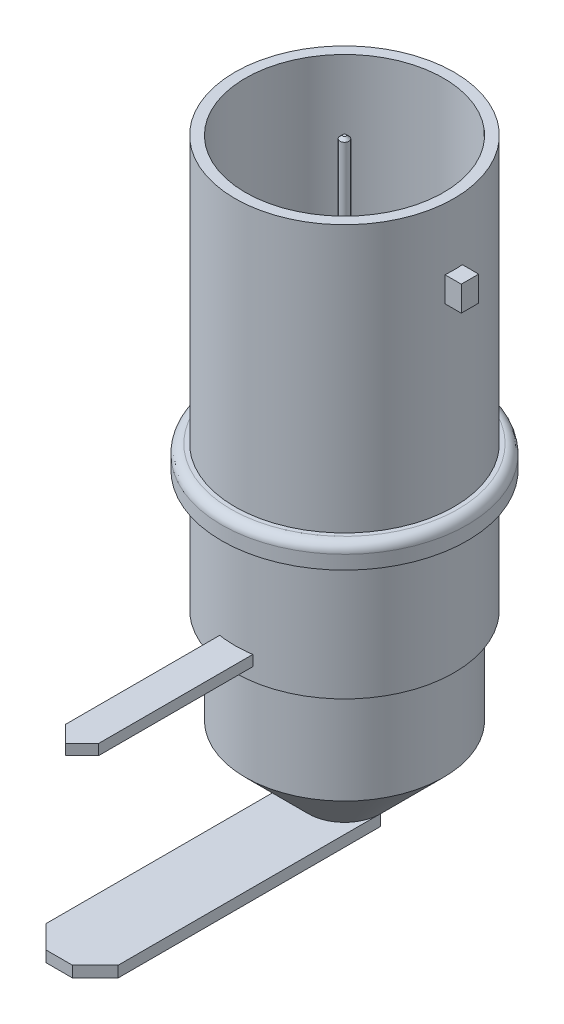
ISO-10303-21;
HEADER;
FILE_DESCRIPTION(('STEP AP214'),'2;1');
FILE_NAME('part.step','',(''),(''),'','','');
FILE_SCHEMA(('AUTOMOTIVE_DESIGN { 1 0 10303 214 1 1 1 1 }'));
ENDSEC;
DATA;
#1=APPLICATION_CONTEXT('core data for automotive mechanical design processes');
#2=APPLICATION_PROTOCOL_DEFINITION('international standard','automotive_design',2000,#1);
#3=PRODUCT_CONTEXT('',#1,'mechanical');
#4=PRODUCT('Part','Part','',(#3));
#5=PRODUCT_RELATED_PRODUCT_CATEGORY('part','',(#4));
#6=PRODUCT_DEFINITION_FORMATION('','',#4);
#7=PRODUCT_DEFINITION_CONTEXT('part definition',#1,'design');
#8=PRODUCT_DEFINITION('design','',#6,#7);
#9=PRODUCT_DEFINITION_SHAPE('','',#8);
#10=(LENGTH_UNIT() NAMED_UNIT(*) SI_UNIT(.MILLI.,.METRE.));
#11=(NAMED_UNIT(*) PLANE_ANGLE_UNIT() SI_UNIT($,.RADIAN.));
#12=(NAMED_UNIT(*) SI_UNIT($,.STERADIAN.) SOLID_ANGLE_UNIT());
#13=UNCERTAINTY_MEASURE_WITH_UNIT(LENGTH_MEASURE(1.E-05),#10,'distance_accuracy_value','');
#14=(GEOMETRIC_REPRESENTATION_CONTEXT(3) GLOBAL_UNCERTAINTY_ASSIGNED_CONTEXT((#13)) GLOBAL_UNIT_ASSIGNED_CONTEXT((#10,
#11,#12)) REPRESENTATION_CONTEXT('',''));
#15=CARTESIAN_POINT('',(0.,0.,0.));
#16=DIRECTION('',(0.,0.,1.));
#17=DIRECTION('',(1.,0.,0.));
#18=AXIS2_PLACEMENT_3D('',#15,#16,#17);
#19=CARTESIAN_POINT('',(0.,-7.2,0.));
#20=DIRECTION('',(0.,1.,0.));
#21=DIRECTION('',(0.,0.,1.));
#22=AXIS2_PLACEMENT_3D('',#19,#20,#21);
#23=CYLINDRICAL_SURFACE('',#22,4.34149701495423);
#24=CARTESIAN_POINT('',(0.,-4.2,0.));
#25=DIRECTION('',(0.,1.,0.));
#26=DIRECTION('',(0.,0.,1.));
#27=AXIS2_PLACEMENT_3D('',#24,#25,#26);
#28=CIRCLE('',#27,4.34149701495423);
#29=CARTESIAN_POINT('',(0.,-4.2,4.34149701495423));
#30=VERTEX_POINT('',#29);
#31=EDGE_CURVE('E52',#30,#30,#28,.T.);
#32=ORIENTED_EDGE('',*,*,#31,.T.);
#33=EDGE_LOOP('',(#32));
#34=FACE_BOUND('',#33,.T.);
#35=CARTESIAN_POINT('',(0.,9.3,0.));
#36=DIRECTION('',(0.,1.,0.));
#37=DIRECTION('',(0.,0.,1.));
#38=AXIS2_PLACEMENT_3D('',#35,#36,#37);
#39=CIRCLE('',#38,4.34149701495423);
#40=CARTESIAN_POINT('',(0.,9.3,4.34149701495423));
#41=VERTEX_POINT('',#40);
#42=EDGE_CURVE('E56',#41,#41,#39,.T.);
#43=ORIENTED_EDGE('',*,*,#42,.F.);
#44=EDGE_LOOP('',(#43));
#45=FACE_BOUND('',#44,.T.);
#46=ADVANCED_FACE('F44',(#34,#45),#23,.T.);
#47=CARTESIAN_POINT('',(0.,-7.2,0.));
#48=DIRECTION('',(0.,1.,0.));
#49=DIRECTION('',(0.,0.,1.));
#50=AXIS2_PLACEMENT_3D('',#47,#48,#49);
#51=PLANE('',#50);
#52=CARTESIAN_POINT('',(0.,-7.2,0.));
#53=DIRECTION('',(0.,1.,0.));
#54=DIRECTION('',(0.,0.,1.));
#55=AXIS2_PLACEMENT_3D('',#52,#53,#54);
#56=CIRCLE('',#55,1.34149701495422);
#57=CARTESIAN_POINT('',(0.,-7.2,1.34149701495421));
#58=VERTEX_POINT('',#57);
#59=EDGE_CURVE('E11',#58,#58,#56,.F.);
#60=ORIENTED_EDGE('',*,*,#59,.T.);
#61=EDGE_LOOP('',(#60));
#62=FACE_BOUND('',#61,.T.);
#63=ADVANCED_FACE('F66',(#62),#51,.F.);
#64=CARTESIAN_POINT('',(0.,9.3,0.));
#65=DIRECTION('',(0.,1.,0.));
#66=DIRECTION('',(0.,0.,1.));
#67=AXIS2_PLACEMENT_3D('',#64,#65,#66);
#68=PLANE('',#67);
#69=ORIENTED_EDGE('',*,*,#42,.T.);
#70=EDGE_LOOP('',(#69));
#71=FACE_BOUND('',#70,.T.);
#72=ADVANCED_FACE('F63',(#71),#68,.T.);
#73=CARTESIAN_POINT('',(0.,-4.2,0.));
#74=DIRECTION('',(0.,1.,0.));
#75=DIRECTION('',(0.,0.,1.));
#76=AXIS2_PLACEMENT_3D('',#73,#74,#75);
#77=CONICAL_SURFACE('',#76,4.34149701495423,0.78539816339745);
#78=CARTESIAN_POINT('',(0.,-7.2,1.34149701495421));
#79=CARTESIAN_POINT('',(0.,-7.16875,1.37274701495421));
#80=CARTESIAN_POINT('',(0.,-7.1375,1.40399701495421));
#81=CARTESIAN_POINT('',(0.,-7.075,1.46649701495422));
#82=CARTESIAN_POINT('',(0.,-7.04375,1.49774701495422));
#83=CARTESIAN_POINT('',(0.,-6.98125,1.56024701495422));
#84=CARTESIAN_POINT('',(0.,-6.95,1.59149701495422));
#85=CARTESIAN_POINT('',(0.,-6.8875,1.65399701495422));
#86=CARTESIAN_POINT('',(0.,-6.85625,1.68524701495422));
#87=CARTESIAN_POINT('',(0.,-6.79375,1.74774701495422));
#88=CARTESIAN_POINT('',(0.,-6.7625,1.77899701495422));
#89=CARTESIAN_POINT('',(0.,-6.7,1.84149701495422));
#90=CARTESIAN_POINT('',(0.,-6.66875,1.87274701495422));
#91=CARTESIAN_POINT('',(0.,-6.60625,1.93524701495422));
#92=CARTESIAN_POINT('',(0.,-6.575,1.96649701495422));
#93=CARTESIAN_POINT('',(0.,-6.5125,2.02899701495422));
#94=CARTESIAN_POINT('',(0.,-6.48125,2.06024701495422));
#95=CARTESIAN_POINT('',(0.,-6.41875,2.12274701495422));
#96=CARTESIAN_POINT('',(0.,-6.3875,2.15399701495422));
#97=CARTESIAN_POINT('',(0.,-6.325,2.21649701495422));
#98=CARTESIAN_POINT('',(0.,-6.29375,2.24774701495422));
#99=CARTESIAN_POINT('',(0.,-6.23125,2.31024701495422));
#100=CARTESIAN_POINT('',(0.,-6.2,2.34149701495422));
#101=CARTESIAN_POINT('',(0.,-6.1375,2.40399701495422));
#102=CARTESIAN_POINT('',(0.,-6.10625,2.43524701495422));
#103=CARTESIAN_POINT('',(0.,-6.04375,2.49774701495422));
#104=CARTESIAN_POINT('',(0.,-6.0125,2.52899701495422));
#105=CARTESIAN_POINT('',(0.,-5.95,2.59149701495422));
#106=CARTESIAN_POINT('',(0.,-5.91875,2.62274701495422));
#107=CARTESIAN_POINT('',(0.,-5.85625,2.68524701495422));
#108=CARTESIAN_POINT('',(0.,-5.825,2.71649701495422));
#109=CARTESIAN_POINT('',(0.,-5.7625,2.77899701495422));
#110=CARTESIAN_POINT('',(0.,-5.73125,2.81024701495422));
#111=CARTESIAN_POINT('',(0.,-5.66875,2.87274701495422));
#112=CARTESIAN_POINT('',(0.,-5.6375,2.90399701495422));
#113=CARTESIAN_POINT('',(0.,-5.575,2.96649701495422));
#114=CARTESIAN_POINT('',(0.,-5.54375,2.99774701495422));
#115=CARTESIAN_POINT('',(0.,-5.48125,3.06024701495422));
#116=CARTESIAN_POINT('',(0.,-5.45,3.09149701495422));
#117=CARTESIAN_POINT('',(0.,-5.3875,3.15399701495422));
#118=CARTESIAN_POINT('',(0.,-5.35625,3.18524701495422));
#119=CARTESIAN_POINT('',(0.,-5.29375,3.24774701495422));
#120=CARTESIAN_POINT('',(0.,-5.2625,3.27899701495422));
#121=CARTESIAN_POINT('',(0.,-5.2,3.34149701495422));
#122=CARTESIAN_POINT('',(0.,-5.16875,3.37274701495422));
#123=CARTESIAN_POINT('',(0.,-5.10625,3.43524701495422));
#124=CARTESIAN_POINT('',(0.,-5.075,3.46649701495422));
#125=CARTESIAN_POINT('',(0.,-5.0125,3.52899701495422));
#126=CARTESIAN_POINT('',(0.,-4.98125,3.56024701495422));
#127=CARTESIAN_POINT('',(0.,-4.91875,3.62274701495422));
#128=CARTESIAN_POINT('',(0.,-4.8875,3.65399701495422));
#129=CARTESIAN_POINT('',(0.,-4.825,3.71649701495422));
#130=CARTESIAN_POINT('',(0.,-4.79375,3.74774701495422));
#131=CARTESIAN_POINT('',(0.,-4.73125,3.81024701495422));
#132=CARTESIAN_POINT('',(0.,-4.7,3.84149701495422));
#133=CARTESIAN_POINT('',(0.,-4.6375,3.90399701495422));
#134=CARTESIAN_POINT('',(0.,-4.60625,3.93524701495422));
#135=CARTESIAN_POINT('',(0.,-4.54375,3.99774701495422));
#136=CARTESIAN_POINT('',(0.,-4.5125,4.02899701495423));
#137=CARTESIAN_POINT('',(0.,-4.45,4.09149701495423));
#138=CARTESIAN_POINT('',(0.,-4.41875,4.12274701495423));
#139=CARTESIAN_POINT('',(0.,-4.35625,4.18524701495423));
#140=CARTESIAN_POINT('',(0.,-4.325,4.21649701495423));
#141=CARTESIAN_POINT('',(0.,-4.2625,4.27899701495423));
#142=CARTESIAN_POINT('',(0.,-4.23125,4.31024701495423));
#143=CARTESIAN_POINT('',(0.,-4.2,4.34149701495423));
#144=B_SPLINE_CURVE_WITH_KNOTS('',3,(#78,#79,#80,#81,#82,#83,#84,#85,#86,#87,#88,#89,#90,#91,
#92,#93,#94,#95,#96,#97,#98,#99,#100,#101,#102,#103,#104,#105,#106,#107,#108,#109,#110,#111,
#112,#113,#114,#115,#116,#117,#118,#119,#120,#121,#122,#123,#124,#125,#126,#127,#128,#129,#130,
#131,#132,#133,#134,#135,#136,#137,#138,#139,#140,#141,#142,#143),.UNSPECIFIED.,.F.,.F.,(4,2,2,
2,2,2,2,2,2,2,2,2,2,2,2,2,2,2,2,2,2,2,2,2,2,2,2,2,2,2,2,2,4),(0.,0.132582521472478,
0.265165042944956,0.397747564417433,0.530330085889911,0.662912607362389,0.795495128834868,
0.928077650307345,1.06066017177982,1.1932426932523,1.32582521472478,1.45840773619726,
1.59099025766974,1.72357277914221,1.85615530061469,1.98873782208717,2.12132034355965,
2.25390286503212,2.3864853865046,2.51906790797708,2.65165042944956,2.78423295092204,
2.91681547239451,3.04939799386699,3.18198051533947,3.31456303681195,3.44714555828442,
3.5797280797569,3.71231060122938,3.84489312270186,3.97747564417434,4.11005816564681,
4.24264068711929),.UNSPECIFIED.);
#145=EDGE_CURVE('BSEAM47',#58,#30,#144,.T.);
#146=ORIENTED_EDGE('',*,*,#59,.F.);
#147=ORIENTED_EDGE('',*,*,#31,.F.);
#148=ORIENTED_EDGE('',*,*,#145,.T.);
#149=ORIENTED_EDGE('',*,*,#145,.F.);
#150=EDGE_LOOP('',(#146,#148,#147,#149));
#151=FACE_BOUND('',#150,.T.);
#152=ADVANCED_FACE('F47',(#151),#77,.T.);
#153=CLOSED_SHELL('',(#46,#63,#72,#152));
#154=MANIFOLD_SOLID_BREP('B2',#153);
#155=CARTESIAN_POINT('',(1.58,-7.44245003517757,12.5));
#156=DIRECTION('',(-1.,0.,0.));
#157=DIRECTION('',(0.,0.,1.));
#158=AXIS2_PLACEMENT_3D('',#155,#156,#157);
#159=PLANE('',#158);
#160=DIRECTION('',(0.,0.,-1.));
#161=VECTOR('',#160,1.);
#162=CARTESIAN_POINT('',(1.58,-6.95754996482243,12.5));
#163=LINE('',#162,#161);
#164=CARTESIAN_POINT('',(1.58,-6.95754996482243,11.5));
#165=VERTEX_POINT('',#164);
#166=CARTESIAN_POINT('',(1.58,-6.95754996482243,0.));
#167=VERTEX_POINT('',#166);
#168=EDGE_CURVE('E165',#165,#167,#163,.T.);
#169=ORIENTED_EDGE('',*,*,#168,.F.);
#170=DIRECTION('',(0.,-1.,0.));
#171=VECTOR('',#170,1.);
#172=CARTESIAN_POINT('',(1.58,-7.44245003517757,11.5));
#173=LINE('',#172,#171);
#174=CARTESIAN_POINT('',(1.58,-7.44245003517757,11.5));
#175=VERTEX_POINT('',#174);
#176=EDGE_CURVE('E136',#165,#175,#173,.T.);
#177=ORIENTED_EDGE('',*,*,#176,.T.);
#178=DIRECTION('',(0.,0.,-1.));
#179=VECTOR('',#178,1.);
#180=CARTESIAN_POINT('',(1.58,-7.44245003517757,12.5));
#181=LINE('',#180,#179);
#182=CARTESIAN_POINT('',(1.58,-7.44245003517757,0.));
#183=VERTEX_POINT('',#182);
#184=EDGE_CURVE('E185',#175,#183,#181,.T.);
#185=ORIENTED_EDGE('',*,*,#184,.T.);
#186=DIRECTION('',(0.,1.,0.));
#187=VECTOR('',#186,1.);
#188=CARTESIAN_POINT('',(1.58,-7.44245003517757,0.));
#189=LINE('',#188,#187);
#190=EDGE_CURVE('E181',#183,#167,#189,.T.);
#191=ORIENTED_EDGE('',*,*,#190,.T.);
#192=EDGE_LOOP('',(#169,#177,#185,#191));
#193=FACE_BOUND('',#192,.T.);
#194=ADVANCED_FACE('F112',(#193),#159,.F.);
#195=CARTESIAN_POINT('',(-1.58,-6.95754996482243,12.5));
#196=DIRECTION('',(0.,-1.,0.));
#197=DIRECTION('',(0.,0.,-1.));
#198=AXIS2_PLACEMENT_3D('',#195,#196,#197);
#199=PLANE('',#198);
#200=DIRECTION('',(-1.,0.,0.));
#201=VECTOR('',#200,1.);
#202=CARTESIAN_POINT('',(-1.58,-6.95754996482243,12.5));
#203=LINE('',#202,#201);
#204=CARTESIAN_POINT('',(0.58,-6.95754996482243,12.5));
#205=VERTEX_POINT('',#204);
#206=CARTESIAN_POINT('',(-0.579999999999998,-6.95754996482243,12.5));
#207=VERTEX_POINT('',#206);
#208=EDGE_CURVE('E195',#205,#207,#203,.T.);
#209=ORIENTED_EDGE('',*,*,#208,.F.);
#210=DIRECTION('',(-0.707106781186546,0.,0.707106781186549));
#211=VECTOR('',#210,1.);
#212=CARTESIAN_POINT('',(0.580000000000001,-6.95754996482243,12.5));
#213=LINE('',#212,#211);
#214=EDGE_CURVE('E172',#205,#165,#213,.F.);
#215=ORIENTED_EDGE('',*,*,#214,.T.);
#216=ORIENTED_EDGE('',*,*,#168,.T.);
#217=DIRECTION('',(-1.,0.,0.));
#218=VECTOR('',#217,1.);
#219=CARTESIAN_POINT('',(-1.58,-6.95754996482243,0.));
#220=LINE('',#219,#218);
#221=CARTESIAN_POINT('',(-1.58,-6.95754996482243,0.));
#222=VERTEX_POINT('',#221);
#223=EDGE_CURVE('E170',#167,#222,#220,.T.);
#224=ORIENTED_EDGE('',*,*,#223,.T.);
#225=DIRECTION('',(0.,0.,-1.));
#226=VECTOR('',#225,1.);
#227=CARTESIAN_POINT('',(-1.58,-6.95754996482243,12.5));
#228=LINE('',#227,#226);
#229=CARTESIAN_POINT('',(-1.58,-6.95754996482243,11.5));
#230=VERTEX_POINT('',#229);
#231=EDGE_CURVE('E175',#230,#222,#228,.T.);
#232=ORIENTED_EDGE('',*,*,#231,.F.);
#233=DIRECTION('',(-0.707106781186546,0.,-0.707106781186549));
#234=VECTOR('',#233,1.);
#235=CARTESIAN_POINT('',(-0.579999999999998,-6.95754996482243,12.5));
#236=LINE('',#235,#234);
#237=EDGE_CURVE('E205',#230,#207,#236,.F.);
#238=ORIENTED_EDGE('',*,*,#237,.T.);
#239=EDGE_LOOP('',(#209,#215,#216,#224,#232,#238));
#240=FACE_BOUND('',#239,.T.);
#241=ADVANCED_FACE('F168',(#240),#199,.F.);
#242=CARTESIAN_POINT('',(-1.58,-7.44245003517757,12.5));
#243=DIRECTION('',(1.,0.,0.));
#244=DIRECTION('',(0.,0.,-1.));
#245=AXIS2_PLACEMENT_3D('',#242,#243,#244);
#246=PLANE('',#245);
#247=DIRECTION('',(0.,0.,-1.));
#248=VECTOR('',#247,1.);
#249=CARTESIAN_POINT('',(-1.58,-7.44245003517757,12.5));
#250=LINE('',#249,#248);
#251=CARTESIAN_POINT('',(-1.58,-7.44245003517757,11.5));
#252=VERTEX_POINT('',#251);
#253=CARTESIAN_POINT('',(-1.58,-7.44245003517757,0.));
#254=VERTEX_POINT('',#253);
#255=EDGE_CURVE('E197',#252,#254,#250,.T.);
#256=ORIENTED_EDGE('',*,*,#255,.F.);
#257=DIRECTION('',(0.,1.,0.));
#258=VECTOR('',#257,1.);
#259=CARTESIAN_POINT('',(-1.58,-7.44245003517757,11.5));
#260=LINE('',#259,#258);
#261=EDGE_CURVE('E42',#252,#230,#260,.T.);
#262=ORIENTED_EDGE('',*,*,#261,.T.);
#263=ORIENTED_EDGE('',*,*,#231,.T.);
#264=DIRECTION('',(0.,-1.,0.));
#265=VECTOR('',#264,1.);
#266=CARTESIAN_POINT('',(-1.58,-7.44245003517757,0.));
#267=LINE('',#266,#265);
#268=EDGE_CURVE('E183',#222,#254,#267,.T.);
#269=ORIENTED_EDGE('',*,*,#268,.T.);
#270=EDGE_LOOP('',(#256,#262,#263,#269));
#271=FACE_BOUND('',#270,.T.);
#272=ADVANCED_FACE('F233',(#271),#246,.F.);
#273=CARTESIAN_POINT('',(-1.58,-7.44245003517757,12.5));
#274=DIRECTION('',(0.,1.,0.));
#275=DIRECTION('',(0.,0.,1.));
#276=AXIS2_PLACEMENT_3D('',#273,#274,#275);
#277=PLANE('',#276);
#278=ORIENTED_EDGE('',*,*,#184,.F.);
#279=DIRECTION('',(0.707106781186546,0.,-0.707106781186549));
#280=VECTOR('',#279,1.);
#281=CARTESIAN_POINT('',(0.580000000000001,-7.44245003517757,12.5));
#282=LINE('',#281,#280);
#283=CARTESIAN_POINT('',(0.58,-7.44245003517757,12.5));
#284=VERTEX_POINT('',#283);
#285=EDGE_CURVE('E121',#175,#284,#282,.F.);
#286=ORIENTED_EDGE('',*,*,#285,.T.);
#287=DIRECTION('',(1.,0.,0.));
#288=VECTOR('',#287,1.);
#289=CARTESIAN_POINT('',(-1.58,-7.44245003517757,12.5));
#290=LINE('',#289,#288);
#291=CARTESIAN_POINT('',(-0.579999999999998,-7.44245003517757,12.5));
#292=VERTEX_POINT('',#291);
#293=EDGE_CURVE('E189',#292,#284,#290,.T.);
#294=ORIENTED_EDGE('',*,*,#293,.F.);
#295=DIRECTION('',(0.707106781186546,0.,0.707106781186549));
#296=VECTOR('',#295,1.);
#297=CARTESIAN_POINT('',(-0.579999999999998,-7.44245003517757,12.5));
#298=LINE('',#297,#296);
#299=EDGE_CURVE('E128',#292,#252,#298,.F.);
#300=ORIENTED_EDGE('',*,*,#299,.T.);
#301=ORIENTED_EDGE('',*,*,#255,.T.);
#302=DIRECTION('',(1.,0.,0.));
#303=VECTOR('',#302,1.);
#304=CARTESIAN_POINT('',(-1.58,-7.44245003517757,0.));
#305=LINE('',#304,#303);
#306=EDGE_CURVE('E193',#254,#183,#305,.T.);
#307=ORIENTED_EDGE('',*,*,#306,.T.);
#308=EDGE_LOOP('',(#278,#286,#294,#300,#301,#307));
#309=FACE_BOUND('',#308,.T.);
#310=ADVANCED_FACE('F211',(#309),#277,.F.);
#311=CARTESIAN_POINT('',(0.,0.,12.5));
#312=DIRECTION('',(0.,0.,-1.));
#313=DIRECTION('',(-1.,0.,0.));
#314=AXIS2_PLACEMENT_3D('',#311,#312,#313);
#315=PLANE('',#314);
#316=ORIENTED_EDGE('',*,*,#293,.T.);
#317=DIRECTION('',(0.,1.,0.));
#318=VECTOR('',#317,1.);
#319=CARTESIAN_POINT('',(0.580000000000001,0.,12.5));
#320=LINE('',#319,#318);
#321=EDGE_CURVE('E202',#284,#205,#320,.T.);
#322=ORIENTED_EDGE('',*,*,#321,.T.);
#323=ORIENTED_EDGE('',*,*,#208,.T.);
#324=DIRECTION('',(0.,-1.,0.));
#325=VECTOR('',#324,1.);
#326=CARTESIAN_POINT('',(-0.579999999999998,0.,12.5));
#327=LINE('',#326,#325);
#328=EDGE_CURVE('E174',#207,#292,#327,.T.);
#329=ORIENTED_EDGE('',*,*,#328,.T.);
#330=EDGE_LOOP('',(#316,#322,#323,#329));
#331=FACE_BOUND('',#330,.T.);
#332=ADVANCED_FACE('F215',(#331),#315,.F.);
#333=CARTESIAN_POINT('',(0.,0.,0.));
#334=DIRECTION('',(0.,0.,-1.));
#335=DIRECTION('',(-1.,0.,0.));
#336=AXIS2_PLACEMENT_3D('',#333,#334,#335);
#337=PLANE('',#336);
#338=ORIENTED_EDGE('',*,*,#190,.F.);
#339=ORIENTED_EDGE('',*,*,#306,.F.);
#340=ORIENTED_EDGE('',*,*,#268,.F.);
#341=ORIENTED_EDGE('',*,*,#223,.F.);
#342=EDGE_LOOP('',(#338,#339,#340,#341));
#343=FACE_BOUND('',#342,.T.);
#344=ADVANCED_FACE('F179',(#343),#337,.T.);
#345=CARTESIAN_POINT('',(0.580000000000001,0.,12.5));
#346=DIRECTION('',(-0.707106781186549,0.,-0.707106781186546));
#347=DIRECTION('',(0.,1.,0.));
#348=AXIS2_PLACEMENT_3D('',#345,#346,#347);
#349=PLANE('',#348);
#350=ORIENTED_EDGE('',*,*,#285,.F.);
#351=ORIENTED_EDGE('',*,*,#176,.F.);
#352=ORIENTED_EDGE('',*,*,#214,.F.);
#353=ORIENTED_EDGE('',*,*,#321,.F.);
#354=EDGE_LOOP('',(#350,#351,#352,#353));
#355=FACE_BOUND('',#354,.T.);
#356=ADVANCED_FACE('F218',(#355),#349,.F.);
#357=CARTESIAN_POINT('',(-0.579999999999998,0.,12.5));
#358=DIRECTION('',(0.707106781186549,0.,-0.707106781186546));
#359=DIRECTION('',(0.,-1.,0.));
#360=AXIS2_PLACEMENT_3D('',#357,#358,#359);
#361=PLANE('',#360);
#362=ORIENTED_EDGE('',*,*,#237,.F.);
#363=ORIENTED_EDGE('',*,*,#261,.F.);
#364=ORIENTED_EDGE('',*,*,#299,.F.);
#365=ORIENTED_EDGE('',*,*,#328,.F.);
#366=EDGE_LOOP('',(#362,#363,#364,#365));
#367=FACE_BOUND('',#366,.T.);
#368=ADVANCED_FACE('F115',(#367),#361,.F.);
#369=CLOSED_SHELL('',(#194,#241,#272,#310,#332,#344,#356,#368));
#370=MANIFOLD_SOLID_BREP('B6',#369);
#371=CARTESIAN_POINT('',(0.725000000000001,0.568107864049923,12.5));
#372=DIRECTION('',(-1.,0.,0.));
#373=DIRECTION('',(0.,0.,1.));
#374=AXIS2_PLACEMENT_3D('',#371,#372,#373);
#375=PLANE('',#374);
#376=DIRECTION('',(0.,0.,-1.));
#377=VECTOR('',#376,1.);
#378=CARTESIAN_POINT('',(0.725000000000001,1.03189213595008,12.5));
#379=LINE('',#378,#377);
#380=CARTESIAN_POINT('',(0.725000000000001,1.03189213595008,11.5));
#381=VERTEX_POINT('',#380);
#382=CARTESIAN_POINT('',(0.725000000000001,1.03189213595008,0.));
#383=VERTEX_POINT('',#382);
#384=EDGE_CURVE('E344',#381,#383,#379,.T.);
#385=ORIENTED_EDGE('',*,*,#384,.F.);
#386=DIRECTION('',(0.,-1.,0.));
#387=VECTOR('',#386,1.);
#388=CARTESIAN_POINT('',(0.725000000000001,0.568107864049923,11.5));
#389=LINE('',#388,#387);
#390=CARTESIAN_POINT('',(0.725000000000001,0.568107864049923,11.5));
#391=VERTEX_POINT('',#390);
#392=EDGE_CURVE('E110',#381,#391,#389,.T.);
#393=ORIENTED_EDGE('',*,*,#392,.T.);
#394=DIRECTION('',(0.,0.,-1.));
#395=VECTOR('',#394,1.);
#396=CARTESIAN_POINT('',(0.725000000000001,0.568107864049923,12.5));
#397=LINE('',#396,#395);
#398=CARTESIAN_POINT('',(0.725000000000001,0.568107864049923,0.));
#399=VERTEX_POINT('',#398);
#400=EDGE_CURVE('E364',#391,#399,#397,.T.);
#401=ORIENTED_EDGE('',*,*,#400,.T.);
#402=DIRECTION('',(0.,1.,0.));
#403=VECTOR('',#402,1.);
#404=CARTESIAN_POINT('',(0.725000000000001,0.568107864049923,0.));
#405=LINE('',#404,#403);
#406=EDGE_CURVE('E359',#399,#383,#405,.T.);
#407=ORIENTED_EDGE('',*,*,#406,.T.);
#408=EDGE_LOOP('',(#385,#393,#401,#407));
#409=FACE_BOUND('',#408,.T.);
#410=ADVANCED_FACE('F301',(#409),#375,.F.);
#411=CARTESIAN_POINT('',(-0.724999999999999,1.03189213595008,12.5));
#412=DIRECTION('',(0.,-1.,0.));
#413=DIRECTION('',(0.,0.,-1.));
#414=AXIS2_PLACEMENT_3D('',#411,#412,#413);
#415=PLANE('',#414);
#416=DIRECTION('',(0.,0.,-1.));
#417=VECTOR('',#416,1.);
#418=CARTESIAN_POINT('',(-0.724999999999999,1.03189213595008,12.5));
#419=LINE('',#418,#417);
#420=CARTESIAN_POINT('',(-0.724999999999999,1.03189213595008,11.5));
#421=VERTEX_POINT('',#420);
#422=CARTESIAN_POINT('',(-0.724999999999999,1.03189213595008,0.));
#423=VERTEX_POINT('',#422);
#424=EDGE_CURVE('E353',#421,#423,#419,.T.);
#425=ORIENTED_EDGE('',*,*,#424,.F.);
#426=DIRECTION('',(-0.707106781186546,0.,-0.707106781186549));
#427=VECTOR('',#426,1.);
#428=CARTESIAN_POINT('',(0.275000000000002,1.03189213595008,12.5));
#429=LINE('',#428,#427);
#430=CARTESIAN_POINT('',(0.,1.03189213595008,12.225));
#431=VERTEX_POINT('',#430);
#432=EDGE_CURVE('E311',#421,#431,#429,.F.);
#433=ORIENTED_EDGE('',*,*,#432,.T.);
#434=DIRECTION('',(-0.707106781186546,0.,0.707106781186549));
#435=VECTOR('',#434,1.);
#436=CARTESIAN_POINT('',(-0.275,1.03189213595008,12.5));
#437=LINE('',#436,#435);
#438=EDGE_CURVE('E321',#431,#381,#437,.F.);
#439=ORIENTED_EDGE('',*,*,#438,.T.);
#440=ORIENTED_EDGE('',*,*,#384,.T.);
#441=DIRECTION('',(-1.,0.,0.));
#442=VECTOR('',#441,1.);
#443=CARTESIAN_POINT('',(-0.724999999999999,1.03189213595008,0.));
#444=LINE('',#443,#442);
#445=EDGE_CURVE('E347',#383,#423,#444,.T.);
#446=ORIENTED_EDGE('',*,*,#445,.T.);
#447=EDGE_LOOP('',(#425,#433,#439,#440,#446));
#448=FACE_BOUND('',#447,.T.);
#449=ADVANCED_FACE('F346',(#448),#415,.F.);
#450=CARTESIAN_POINT('',(-0.724999999999999,0.568107864049923,12.5));
#451=DIRECTION('',(1.,0.,0.));
#452=DIRECTION('',(0.,0.,-1.));
#453=AXIS2_PLACEMENT_3D('',#450,#451,#452);
#454=PLANE('',#453);
#455=DIRECTION('',(0.,0.,-1.));
#456=VECTOR('',#455,1.);
#457=CARTESIAN_POINT('',(-0.724999999999999,0.568107864049923,12.5));
#458=LINE('',#457,#456);
#459=CARTESIAN_POINT('',(-0.724999999999999,0.568107864049923,11.5));
#460=VERTEX_POINT('',#459);
#461=CARTESIAN_POINT('',(-0.724999999999999,0.568107864049923,0.));
#462=VERTEX_POINT('',#461);
#463=EDGE_CURVE('E373',#460,#462,#458,.T.);
#464=ORIENTED_EDGE('',*,*,#463,.F.);
#465=DIRECTION('',(0.,1.,0.));
#466=VECTOR('',#465,1.);
#467=CARTESIAN_POINT('',(-0.724999999999999,0.568107864049923,11.5));
#468=LINE('',#467,#466);
#469=EDGE_CURVE('E379',#460,#421,#468,.T.);
#470=ORIENTED_EDGE('',*,*,#469,.T.);
#471=ORIENTED_EDGE('',*,*,#424,.T.);
#472=DIRECTION('',(0.,-1.,0.));
#473=VECTOR('',#472,1.);
#474=CARTESIAN_POINT('',(-0.724999999999999,0.568107864049923,0.));
#475=LINE('',#474,#473);
#476=EDGE_CURVE('E361',#423,#462,#475,.T.);
#477=ORIENTED_EDGE('',*,*,#476,.T.);
#478=EDGE_LOOP('',(#464,#470,#471,#477));
#479=FACE_BOUND('',#478,.T.);
#480=ADVANCED_FACE('F386',(#479),#454,.F.);
#481=CARTESIAN_POINT('',(-0.724999999999999,0.568107864049923,12.5));
#482=DIRECTION('',(0.,1.,0.));
#483=DIRECTION('',(0.,0.,1.));
#484=AXIS2_PLACEMENT_3D('',#481,#482,#483);
#485=PLANE('',#484);
#486=DIRECTION('',(0.707106781186546,0.,-0.707106781186549));
#487=VECTOR('',#486,1.);
#488=CARTESIAN_POINT('',(-0.275,0.568107864049923,12.5));
#489=LINE('',#488,#487);
#490=CARTESIAN_POINT('',(0.,0.568107864049923,12.225));
#491=VERTEX_POINT('',#490);
#492=EDGE_CURVE('E352',#391,#491,#489,.F.);
#493=ORIENTED_EDGE('',*,*,#492,.T.);
#494=DIRECTION('',(0.707106781186546,0.,0.707106781186549));
#495=VECTOR('',#494,1.);
#496=CARTESIAN_POINT('',(0.275000000000002,0.568107864049923,12.5));
#497=LINE('',#496,#495);
#498=EDGE_CURVE('E377',#491,#460,#497,.F.);
#499=ORIENTED_EDGE('',*,*,#498,.T.);
#500=ORIENTED_EDGE('',*,*,#463,.T.);
#501=DIRECTION('',(1.,0.,0.));
#502=VECTOR('',#501,1.);
#503=CARTESIAN_POINT('',(-0.724999999999999,0.568107864049923,0.));
#504=LINE('',#503,#502);
#505=EDGE_CURVE('E370',#462,#399,#504,.T.);
#506=ORIENTED_EDGE('',*,*,#505,.T.);
#507=ORIENTED_EDGE('',*,*,#400,.F.);
#508=EDGE_LOOP('',(#493,#499,#500,#506,#507));
#509=FACE_BOUND('',#508,.T.);
#510=ADVANCED_FACE('F394',(#509),#485,.F.);
#511=CARTESIAN_POINT('',(0.,0.,0.));
#512=DIRECTION('',(0.,0.,-1.));
#513=DIRECTION('',(-1.,0.,0.));
#514=AXIS2_PLACEMENT_3D('',#511,#512,#513);
#515=PLANE('',#514);
#516=ORIENTED_EDGE('',*,*,#406,.F.);
#517=ORIENTED_EDGE('',*,*,#505,.F.);
#518=ORIENTED_EDGE('',*,*,#476,.F.);
#519=ORIENTED_EDGE('',*,*,#445,.F.);
#520=EDGE_LOOP('',(#516,#517,#518,#519));
#521=FACE_BOUND('',#520,.T.);
#522=ADVANCED_FACE('F357',(#521),#515,.T.);
#523=CARTESIAN_POINT('',(-0.275,0.,12.5));
#524=DIRECTION('',(-0.707106781186549,0.,-0.707106781186546));
#525=DIRECTION('',(0.,1.,0.));
#526=AXIS2_PLACEMENT_3D('',#523,#524,#525);
#527=PLANE('',#526);
#528=ORIENTED_EDGE('',*,*,#392,.F.);
#529=ORIENTED_EDGE('',*,*,#438,.F.);
#530=DIRECTION('',(0.,1.,0.));
#531=VECTOR('',#530,1.);
#532=CARTESIAN_POINT('',(0.,0.,12.225));
#533=LINE('',#532,#531);
#534=EDGE_CURVE('E306',#491,#431,#533,.T.);
#535=ORIENTED_EDGE('',*,*,#534,.F.);
#536=ORIENTED_EDGE('',*,*,#492,.F.);
#537=EDGE_LOOP('',(#528,#529,#535,#536));
#538=FACE_BOUND('',#537,.T.);
#539=ADVANCED_FACE('F304',(#538),#527,.F.);
#540=CARTESIAN_POINT('',(0.275000000000002,0.,12.5));
#541=DIRECTION('',(0.707106781186549,0.,-0.707106781186546));
#542=DIRECTION('',(0.,-1.,0.));
#543=AXIS2_PLACEMENT_3D('',#540,#541,#542);
#544=PLANE('',#543);
#545=ORIENTED_EDGE('',*,*,#432,.F.);
#546=ORIENTED_EDGE('',*,*,#469,.F.);
#547=ORIENTED_EDGE('',*,*,#498,.F.);
#548=ORIENTED_EDGE('',*,*,#534,.T.);
#549=EDGE_LOOP('',(#545,#546,#547,#548));
#550=FACE_BOUND('',#549,.T.);
#551=ADVANCED_FACE('F389',(#550),#544,.F.);
#552=CLOSED_SHELL('',(#410,#449,#480,#510,#522,#539,#551));
#553=MANIFOLD_SOLID_BREP('B36',#552);
#554=CARTESIAN_POINT('',(0.,18.5513578094421,0.));
#555=DIRECTION('',(0.,-1.,0.));
#556=DIRECTION('',(0.,0.,-1.));
#557=AXIS2_PLACEMENT_3D('',#554,#555,#556);
#558=CYLINDRICAL_SURFACE('',#557,0.194934422958341);
#559=CARTESIAN_POINT('',(0.,17.873,0.));
#560=DIRECTION('',(0.,1.,0.));
#561=DIRECTION('',(0.,0.,1.));
#562=AXIS2_PLACEMENT_3D('',#559,#560,#561);
#563=CIRCLE('',#562,0.194934422958341);
#564=CARTESIAN_POINT('',(0.,17.873,0.194934422958341));
#565=VERTEX_POINT('',#564);
#566=EDGE_CURVE('E300',#565,#565,#563,.F.);
#567=ORIENTED_EDGE('',*,*,#566,.T.);
#568=EDGE_LOOP('',(#567));
#569=FACE_BOUND('',#568,.T.);
#570=CARTESIAN_POINT('',(0.,5.3,0.));
#571=DIRECTION('',(0.,1.,0.));
#572=DIRECTION('',(0.,0.,1.));
#573=AXIS2_PLACEMENT_3D('',#570,#571,#572);
#574=CIRCLE('',#573,0.194934422958341);
#575=CARTESIAN_POINT('',(0.,5.3,0.194934422958341));
#576=VERTEX_POINT('',#575);
#577=EDGE_CURVE('E477',#576,#576,#574,.T.);
#578=ORIENTED_EDGE('',*,*,#577,.T.);
#579=EDGE_LOOP('',(#578));
#580=FACE_BOUND('',#579,.T.);
#581=ADVANCED_FACE('F465',(#569,#580),#558,.T.);
#582=CARTESIAN_POINT('',(0.,5.3,0.));
#583=DIRECTION('',(0.,1.,0.));
#584=DIRECTION('',(0.,0.,1.));
#585=AXIS2_PLACEMENT_3D('',#582,#583,#584);
#586=PLANE('',#585);
#587=ORIENTED_EDGE('',*,*,#577,.F.);
#588=EDGE_LOOP('',(#587));
#589=FACE_BOUND('',#588,.T.);
#590=ADVANCED_FACE('F485',(#589),#586,.F.);
#591=CARTESIAN_POINT('',(0.,18.,0.));
#592=DIRECTION('',(0.,1.,0.));
#593=DIRECTION('',(0.,0.,1.));
#594=AXIS2_PLACEMENT_3D('',#591,#592,#593);
#595=PLANE('',#594);
#596=CARTESIAN_POINT('',(0.,18.,0.));
#597=DIRECTION('',(0.,1.,0.));
#598=DIRECTION('',(0.,0.,1.));
#599=AXIS2_PLACEMENT_3D('',#596,#597,#598);
#600=CIRCLE('',#599,0.0679344229583475);
#601=CARTESIAN_POINT('',(0.,18.,0.0679344229583475));
#602=VERTEX_POINT('',#601);
#603=EDGE_CURVE('E473',#602,#602,#600,.T.);
#604=ORIENTED_EDGE('',*,*,#603,.T.);
#605=EDGE_LOOP('',(#604));
#606=FACE_BOUND('',#605,.T.);
#607=ADVANCED_FACE('F487',(#606),#595,.T.);
#608=CARTESIAN_POINT('',(0.,18.,0.));
#609=DIRECTION('',(0.,-1.,0.));
#610=DIRECTION('',(0.,0.,-1.));
#611=AXIS2_PLACEMENT_3D('',#608,#609,#610);
#612=CONICAL_SURFACE('',#611,0.0679344229583475,0.785398163397453);
#613=ORIENTED_EDGE('',*,*,#566,.F.);
#614=EDGE_LOOP('',(#613));
#615=FACE_BOUND('',#614,.T.);
#616=ORIENTED_EDGE('',*,*,#603,.F.);
#617=EDGE_LOOP('',(#616));
#618=FACE_BOUND('',#617,.T.);
#619=ADVANCED_FACE('F468',(#615,#618),#612,.T.);
#620=CLOSED_SHELL('',(#581,#590,#607,#619));
#621=MANIFOLD_SOLID_BREP('B104',#620);
#622=CARTESIAN_POINT('',(0.,18.,0.));
#623=DIRECTION('',(0.,-1.,0.));
#624=DIRECTION('',(0.,0.,-1.));
#625=AXIS2_PLACEMENT_3D('',#622,#623,#624);
#626=CYLINDRICAL_SURFACE('',#625,4.8);
#627=CARTESIAN_POINT('',(0.,18.,0.));
#628=DIRECTION('',(0.,1.,0.));
#629=DIRECTION('',(0.,0.,1.));
#630=AXIS2_PLACEMENT_3D('',#627,#628,#629);
#631=CIRCLE('',#630,4.8);
#632=CARTESIAN_POINT('',(0.,18.,4.8));
#633=VERTEX_POINT('',#632);
#634=EDGE_CURVE('E645',#633,#633,#631,.T.);
#635=ORIENTED_EDGE('',*,*,#634,.F.);
#636=EDGE_LOOP('',(#635));
#637=FACE_BOUND('',#636,.T.);
#638=CARTESIAN_POINT('',(0.,6.3,0.));
#639=DIRECTION('',(0.,1.,0.));
#640=DIRECTION('',(0.,0.,1.));
#641=AXIS2_PLACEMENT_3D('',#638,#639,#640);
#642=CIRCLE('',#641,4.8);
#643=CARTESIAN_POINT('',(0.,6.3,4.8));
#644=VERTEX_POINT('',#643);
#645=EDGE_CURVE('E632',#644,#644,#642,.T.);
#646=ORIENTED_EDGE('',*,*,#645,.T.);
#647=EDGE_LOOP('',(#646));
#648=FACE_BOUND('',#647,.T.);
#649=CARTESIAN_POINT('',(0.,15.2916917313647,0.));
#650=DIRECTION('',(0.,-1.,0.));
#651=DIRECTION('',(0.,0.,-1.));
#652=AXIS2_PLACEMENT_3D('',#649,#650,#651);
#653=CIRCLE('',#652,4.8);
#654=CARTESIAN_POINT('',(-4.78485517022198,15.2916917313647,0.381));
#655=VERTEX_POINT('',#654);
#656=CARTESIAN_POINT('',(-4.78485517022198,15.2916917313647,-0.381));
#657=VERTEX_POINT('',#656);
#658=EDGE_CURVE('E546',#655,#657,#653,.T.);
#659=ORIENTED_EDGE('',*,*,#658,.F.);
#660=DIRECTION('',(0.,-1.,0.));
#661=VECTOR('',#660,1.);
#662=CARTESIAN_POINT('',(-4.78485517022198,18.,0.381));
#663=LINE('',#662,#661);
#664=CARTESIAN_POINT('',(-4.78485517022198,14.1904200079408,0.381));
#665=VERTEX_POINT('',#664);
#666=EDGE_CURVE('E666',#655,#665,#663,.T.);
#667=ORIENTED_EDGE('',*,*,#666,.T.);
#668=CARTESIAN_POINT('',(0.,14.1904200079408,0.));
#669=DIRECTION('',(0.,1.,0.));
#670=DIRECTION('',(0.,0.,1.));
#671=AXIS2_PLACEMENT_3D('',#668,#669,#670);
#672=CIRCLE('',#671,4.8);
#673=CARTESIAN_POINT('',(-4.78485517022198,14.1904200079408,-0.381));
#674=VERTEX_POINT('',#673);
#675=EDGE_CURVE('E662',#674,#665,#672,.T.);
#676=ORIENTED_EDGE('',*,*,#675,.F.);
#677=DIRECTION('',(0.,-1.,0.));
#678=VECTOR('',#677,1.);
#679=CARTESIAN_POINT('',(-4.78485517022198,18.,-0.381));
#680=LINE('',#679,#678);
#681=EDGE_CURVE('E659',#657,#674,#680,.T.);
#682=ORIENTED_EDGE('',*,*,#681,.F.);
#683=EDGE_LOOP('',(#659,#667,#676,#682));
#684=FACE_BOUND('',#683,.T.);
#685=DIRECTION('',(0.,-1.,0.));
#686=VECTOR('',#685,1.);
#687=CARTESIAN_POINT('',(4.78485517022198,18.,0.381));
#688=LINE('',#687,#686);
#689=CARTESIAN_POINT('',(4.78485517022198,15.2916917313647,0.381));
#690=VERTEX_POINT('',#689);
#691=CARTESIAN_POINT('',(4.78485517022198,14.1904200079408,0.381));
#692=VERTEX_POINT('',#691);
#693=EDGE_CURVE('E463',#690,#692,#688,.T.);
#694=ORIENTED_EDGE('',*,*,#693,.F.);
#695=CARTESIAN_POINT('',(0.,15.2916917313647,0.));
#696=DIRECTION('',(0.,-1.,0.));
#697=DIRECTION('',(0.,0.,-1.));
#698=AXIS2_PLACEMENT_3D('',#695,#696,#697);
#699=CIRCLE('',#698,4.8);
#700=CARTESIAN_POINT('',(4.78485517022198,15.2916917313647,-0.381));
#701=VERTEX_POINT('',#700);
#702=EDGE_CURVE('E671',#701,#690,#699,.T.);
#703=ORIENTED_EDGE('',*,*,#702,.F.);
#704=DIRECTION('',(0.,-1.,0.));
#705=VECTOR('',#704,1.);
#706=CARTESIAN_POINT('',(4.78485517022198,18.,-0.381));
#707=LINE('',#706,#705);
#708=CARTESIAN_POINT('',(4.78485517022198,14.1904200079408,-0.381));
#709=VERTEX_POINT('',#708);
#710=EDGE_CURVE('E668',#701,#709,#707,.T.);
#711=ORIENTED_EDGE('',*,*,#710,.T.);
#712=CARTESIAN_POINT('',(0.,14.1904200079408,0.));
#713=DIRECTION('',(0.,1.,0.));
#714=DIRECTION('',(0.,0.,1.));
#715=AXIS2_PLACEMENT_3D('',#712,#713,#714);
#716=CIRCLE('',#715,4.8);
#717=EDGE_CURVE('E531',#692,#709,#716,.T.);
#718=ORIENTED_EDGE('',*,*,#717,.F.);
#719=EDGE_LOOP('',(#694,#703,#711,#718));
#720=FACE_BOUND('',#719,.T.);
#721=ADVANCED_FACE('F523',(#637,#648,#684,#720),#626,.T.);
#722=CARTESIAN_POINT('',(0.,0.,0.));
#723=DIRECTION('',(0.,1.,0.));
#724=DIRECTION('',(0.,0.,1.));
#725=AXIS2_PLACEMENT_3D('',#722,#723,#724);
#726=CIRCLE('',#725,4.8);
#727=CARTESIAN_POINT('',(0.,0.,4.8));
#728=VERTEX_POINT('',#727);
#729=EDGE_CURVE('E642',#728,#728,#726,.T.);
#730=ORIENTED_EDGE('',*,*,#729,.T.);
#731=EDGE_LOOP('',(#730));
#732=FACE_BOUND('',#731,.T.);
#733=CARTESIAN_POINT('',(0.,5.3,0.));
#734=DIRECTION('',(0.,1.,0.));
#735=DIRECTION('',(0.,0.,1.));
#736=AXIS2_PLACEMENT_3D('',#733,#734,#735);
#737=CIRCLE('',#736,4.8);
#738=CARTESIAN_POINT('',(0.,5.3,4.8));
#739=VERTEX_POINT('',#738);
#740=EDGE_CURVE('E648',#739,#739,#737,.T.);
#741=ORIENTED_EDGE('',*,*,#740,.F.);
#742=EDGE_LOOP('',(#741));
#743=FACE_BOUND('',#742,.T.);
#744=ADVANCED_FACE('F691',(#732,#743),#626,.T.);
#745=CARTESIAN_POINT('',(0.,18.,0.));
#746=DIRECTION('',(0.,1.,0.));
#747=DIRECTION('',(0.,0.,1.));
#748=AXIS2_PLACEMENT_3D('',#745,#746,#747);
#749=PLANE('',#748);
#750=ORIENTED_EDGE('',*,*,#634,.T.);
#751=EDGE_LOOP('',(#750));
#752=FACE_BOUND('',#751,.T.);
#753=CARTESIAN_POINT('',(0.,18.,0.));
#754=DIRECTION('',(0.,1.,0.));
#755=DIRECTION('',(0.,0.,1.));
#756=AXIS2_PLACEMENT_3D('',#753,#754,#755);
#757=CIRCLE('',#756,4.34149701495423);
#758=CARTESIAN_POINT('',(0.,18.,4.34149701495423));
#759=VERTEX_POINT('',#758);
#760=EDGE_CURVE('E639',#759,#759,#757,.T.);
#761=ORIENTED_EDGE('',*,*,#760,.F.);
#762=EDGE_LOOP('',(#761));
#763=FACE_BOUND('',#762,.T.);
#764=ADVANCED_FACE('F696',(#752,#763),#749,.T.);
#765=CARTESIAN_POINT('',(0.,0.,0.));
#766=DIRECTION('',(0.,1.,0.));
#767=DIRECTION('',(0.,0.,1.));
#768=AXIS2_PLACEMENT_3D('',#765,#766,#767);
#769=PLANE('',#768);
#770=ORIENTED_EDGE('',*,*,#729,.F.);
#771=EDGE_LOOP('',(#770));
#772=FACE_BOUND('',#771,.T.);
#773=CARTESIAN_POINT('',(0.,0.,0.));
#774=DIRECTION('',(0.,1.,0.));
#775=DIRECTION('',(0.,0.,1.));
#776=AXIS2_PLACEMENT_3D('',#773,#774,#775);
#777=CIRCLE('',#776,4.34149701495423);
#778=CARTESIAN_POINT('',(0.,0.,4.34149701495423));
#779=VERTEX_POINT('',#778);
#780=EDGE_CURVE('E638',#779,#779,#777,.T.);
#781=ORIENTED_EDGE('',*,*,#780,.T.);
#782=EDGE_LOOP('',(#781));
#783=FACE_BOUND('',#782,.T.);
#784=ADVANCED_FACE('F701',(#772,#783),#769,.F.);
#785=CARTESIAN_POINT('',(0.,18.,0.));
#786=DIRECTION('',(0.,-1.,0.));
#787=DIRECTION('',(0.,0.,-1.));
#788=AXIS2_PLACEMENT_3D('',#785,#786,#787);
#789=CYLINDRICAL_SURFACE('',#788,4.34149701495423);
#790=ORIENTED_EDGE('',*,*,#760,.T.);
#791=EDGE_LOOP('',(#790));
#792=FACE_BOUND('',#791,.T.);
#793=ORIENTED_EDGE('',*,*,#780,.F.);
#794=EDGE_LOOP('',(#793));
#795=FACE_BOUND('',#794,.T.);
#796=ADVANCED_FACE('F704',(#792,#795),#789,.F.);
#797=CARTESIAN_POINT('',(0.,6.3,0.));
#798=DIRECTION('',(0.,1.,0.));
#799=DIRECTION('',(0.,0.,1.));
#800=AXIS2_PLACEMENT_3D('',#797,#798,#799);
#801=PLANE('',#800);
#802=CARTESIAN_POINT('',(0.,6.3,0.));
#803=DIRECTION('',(0.,1.,0.));
#804=DIRECTION('',(0.,0.,1.));
#805=AXIS2_PLACEMENT_3D('',#802,#803,#804);
#806=CIRCLE('',#805,4.98010972242008);
#807=CARTESIAN_POINT('',(0.,6.3,4.98010972242008));
#808=VERTEX_POINT('',#807);
#809=EDGE_CURVE('E653',#808,#808,#806,.T.);
#810=ORIENTED_EDGE('',*,*,#809,.T.);
#811=EDGE_LOOP('',(#810));
#812=FACE_BOUND('',#811,.T.);
#813=ORIENTED_EDGE('',*,*,#645,.F.);
#814=EDGE_LOOP('',(#813));
#815=FACE_BOUND('',#814,.T.);
#816=ADVANCED_FACE('F711',(#812,#815),#801,.T.);
#817=CARTESIAN_POINT('',(0.,5.3,0.));
#818=DIRECTION('',(0.,1.,0.));
#819=DIRECTION('',(0.,0.,1.));
#820=AXIS2_PLACEMENT_3D('',#817,#818,#819);
#821=PLANE('',#820);
#822=CARTESIAN_POINT('',(0.,5.3,0.));
#823=DIRECTION('',(0.,1.,0.));
#824=DIRECTION('',(0.,0.,1.));
#825=AXIS2_PLACEMENT_3D('',#822,#823,#824);
#826=CIRCLE('',#825,5.38010972242008);
#827=CARTESIAN_POINT('',(0.,5.3,5.38010972242008));
#828=VERTEX_POINT('',#827);
#829=EDGE_CURVE('E635',#828,#828,#826,.T.);
#830=ORIENTED_EDGE('',*,*,#829,.F.);
#831=EDGE_LOOP('',(#830));
#832=FACE_BOUND('',#831,.T.);
#833=ORIENTED_EDGE('',*,*,#740,.T.);
#834=EDGE_LOOP('',(#833));
#835=FACE_BOUND('',#834,.T.);
#836=ADVANCED_FACE('F716',(#832,#835),#821,.F.);
#837=CARTESIAN_POINT('',(0.,6.3,0.));
#838=DIRECTION('',(0.,-1.,0.));
#839=DIRECTION('',(0.,0.,-1.));
#840=AXIS2_PLACEMENT_3D('',#837,#838,#839);
#841=CYLINDRICAL_SURFACE('',#840,5.38010972242008);
#842=CARTESIAN_POINT('',(0.,5.9,0.));
#843=DIRECTION('',(0.,1.,0.));
#844=DIRECTION('',(0.,0.,1.));
#845=AXIS2_PLACEMENT_3D('',#842,#843,#844);
#846=CIRCLE('',#845,5.38010972242008);
#847=CARTESIAN_POINT('',(0.,5.9,5.38010972242008));
#848=VERTEX_POINT('',#847);
#849=EDGE_CURVE('E656',#848,#848,#846,.F.);
#850=ORIENTED_EDGE('',*,*,#849,.T.);
#851=EDGE_LOOP('',(#850));
#852=FACE_BOUND('',#851,.T.);
#853=ORIENTED_EDGE('',*,*,#829,.T.);
#854=EDGE_LOOP('',(#853));
#855=FACE_BOUND('',#854,.T.);
#856=ADVANCED_FACE('F713',(#852,#855),#841,.T.);
#857=CARTESIAN_POINT('',(0.,5.9,0.));
#858=DIRECTION('',(0.,1.,0.));
#859=DIRECTION('',(0.,0.,1.));
#860=AXIS2_PLACEMENT_3D('',#857,#858,#859);
#861=TOROIDAL_SURFACE('',#860,4.98010972242008,0.4);
#862=ORIENTED_EDGE('',*,*,#849,.F.);
#863=EDGE_LOOP('',(#862));
#864=FACE_BOUND('',#863,.T.);
#865=ORIENTED_EDGE('',*,*,#809,.F.);
#866=EDGE_LOOP('',(#865));
#867=FACE_BOUND('',#866,.T.);
#868=ADVANCED_FACE('F525',(#864,#867),#861,.T.);
#869=CARTESIAN_POINT('',(0.,0.,0.381));
#870=DIRECTION('',(0.,0.,1.));
#871=DIRECTION('',(1.,0.,0.));
#872=AXIS2_PLACEMENT_3D('',#869,#870,#871);
#873=PLANE('',#872);
#874=ORIENTED_EDGE('',*,*,#666,.F.);
#875=DIRECTION('',(-1.,0.,0.));
#876=VECTOR('',#875,1.);
#877=CARTESIAN_POINT('',(-4.61390422520749,15.2916917313647,0.381));
#878=LINE('',#877,#876);
#879=CARTESIAN_POINT('',(-5.5,15.2916917313647,0.381));
#880=VERTEX_POINT('',#879);
#881=EDGE_CURVE('E615',#655,#880,#878,.T.);
#882=ORIENTED_EDGE('',*,*,#881,.T.);
#883=DIRECTION('',(0.,-1.,0.));
#884=VECTOR('',#883,1.);
#885=CARTESIAN_POINT('',(-5.5,15.2916917313647,0.381));
#886=LINE('',#885,#884);
#887=CARTESIAN_POINT('',(-5.5,14.1904200079408,0.381));
#888=VERTEX_POINT('',#887);
#889=EDGE_CURVE('E617',#880,#888,#886,.T.);
#890=ORIENTED_EDGE('',*,*,#889,.T.);
#891=DIRECTION('',(1.,0.,0.));
#892=VECTOR('',#891,1.);
#893=CARTESIAN_POINT('',(-5.5,14.1904200079408,0.381));
#894=LINE('',#893,#892);
#895=EDGE_CURVE('E620',#888,#665,#894,.T.);
#896=ORIENTED_EDGE('',*,*,#895,.T.);
#897=EDGE_LOOP('',(#874,#882,#890,#896));
#898=FACE_BOUND('',#897,.T.);
#899=ADVANCED_FACE('F739',(#898),#873,.T.);
#900=CARTESIAN_POINT('',(0.,0.,-0.381));
#901=DIRECTION('',(0.,0.,1.));
#902=DIRECTION('',(1.,0.,0.));
#903=AXIS2_PLACEMENT_3D('',#900,#901,#902);
#904=PLANE('',#903);
#905=DIRECTION('',(-1.,0.,0.));
#906=VECTOR('',#905,1.);
#907=CARTESIAN_POINT('',(-4.61390422520749,15.2916917313647,-0.381));
#908=LINE('',#907,#906);
#909=CARTESIAN_POINT('',(-5.5,15.2916917313647,-0.381));
#910=VERTEX_POINT('',#909);
#911=EDGE_CURVE('E608',#657,#910,#908,.T.);
#912=ORIENTED_EDGE('',*,*,#911,.F.);
#913=ORIENTED_EDGE('',*,*,#681,.T.);
#914=DIRECTION('',(1.,0.,0.));
#915=VECTOR('',#914,1.);
#916=CARTESIAN_POINT('',(-5.5,14.1904200079408,-0.381));
#917=LINE('',#916,#915);
#918=CARTESIAN_POINT('',(-5.5,14.1904200079408,-0.381));
#919=VERTEX_POINT('',#918);
#920=EDGE_CURVE('E618',#919,#674,#917,.T.);
#921=ORIENTED_EDGE('',*,*,#920,.F.);
#922=DIRECTION('',(0.,-1.,0.));
#923=VECTOR('',#922,1.);
#924=CARTESIAN_POINT('',(-5.5,15.2916917313647,-0.381));
#925=LINE('',#924,#923);
#926=EDGE_CURVE('E610',#910,#919,#925,.T.);
#927=ORIENTED_EDGE('',*,*,#926,.F.);
#928=EDGE_LOOP('',(#912,#913,#921,#927));
#929=FACE_BOUND('',#928,.T.);
#930=ADVANCED_FACE('F728',(#929),#904,.F.);
#931=CARTESIAN_POINT('',(-4.61390422520749,15.2916917313647,0.381));
#932=DIRECTION('',(0.,-1.,0.));
#933=DIRECTION('',(0.,0.,-1.));
#934=AXIS2_PLACEMENT_3D('',#931,#932,#933);
#935=PLANE('',#934);
#936=ORIENTED_EDGE('',*,*,#881,.F.);
#937=ORIENTED_EDGE('',*,*,#658,.T.);
#938=ORIENTED_EDGE('',*,*,#911,.T.);
#939=DIRECTION('',(0.,0.,-1.));
#940=VECTOR('',#939,1.);
#941=CARTESIAN_POINT('',(-5.5,15.2916917313647,0.381));
#942=LINE('',#941,#940);
#943=EDGE_CURVE('E629',#880,#910,#942,.T.);
#944=ORIENTED_EDGE('',*,*,#943,.F.);
#945=EDGE_LOOP('',(#936,#937,#938,#944));
#946=FACE_BOUND('',#945,.T.);
#947=ADVANCED_FACE('F724',(#946),#935,.F.);
#948=CARTESIAN_POINT('',(-5.5,15.2916917313647,0.381));
#949=DIRECTION('',(1.,0.,0.));
#950=DIRECTION('',(0.,0.,-1.));
#951=AXIS2_PLACEMENT_3D('',#948,#949,#950);
#952=PLANE('',#951);
#953=ORIENTED_EDGE('',*,*,#926,.T.);
#954=DIRECTION('',(0.,0.,-1.));
#955=VECTOR('',#954,1.);
#956=CARTESIAN_POINT('',(-5.5,14.1904200079408,0.381));
#957=LINE('',#956,#955);
#958=EDGE_CURVE('E622',#888,#919,#957,.T.);
#959=ORIENTED_EDGE('',*,*,#958,.F.);
#960=ORIENTED_EDGE('',*,*,#889,.F.);
#961=ORIENTED_EDGE('',*,*,#943,.T.);
#962=EDGE_LOOP('',(#953,#959,#960,#961));
#963=FACE_BOUND('',#962,.T.);
#964=ADVANCED_FACE('F727',(#963),#952,.F.);
#965=CARTESIAN_POINT('',(-5.5,14.1904200079408,0.381));
#966=DIRECTION('',(0.,1.,0.));
#967=DIRECTION('',(0.,0.,1.));
#968=AXIS2_PLACEMENT_3D('',#965,#966,#967);
#969=PLANE('',#968);
#970=ORIENTED_EDGE('',*,*,#920,.T.);
#971=ORIENTED_EDGE('',*,*,#675,.T.);
#972=ORIENTED_EDGE('',*,*,#895,.F.);
#973=ORIENTED_EDGE('',*,*,#958,.T.);
#974=EDGE_LOOP('',(#970,#971,#972,#973));
#975=FACE_BOUND('',#974,.T.);
#976=ADVANCED_FACE('F732',(#975),#969,.F.);
#977=CARTESIAN_POINT('',(0.,0.,0.381));
#978=DIRECTION('',(0.,0.,-1.));
#979=DIRECTION('',(-1.,0.,0.));
#980=AXIS2_PLACEMENT_3D('',#977,#978,#979);
#981=PLANE('',#980);
#982=DIRECTION('',(-1.,0.,0.));
#983=VECTOR('',#982,1.);
#984=CARTESIAN_POINT('',(4.61390422520749,15.2916917313647,0.381));
#985=LINE('',#984,#983);
#986=CARTESIAN_POINT('',(5.5,15.2916917313647,0.381));
#987=VERTEX_POINT('',#986);
#988=EDGE_CURVE('E605',#987,#690,#985,.T.);
#989=ORIENTED_EDGE('',*,*,#988,.T.);
#990=ORIENTED_EDGE('',*,*,#693,.T.);
#991=DIRECTION('',(1.,0.,0.));
#992=VECTOR('',#991,1.);
#993=CARTESIAN_POINT('',(5.5,14.1904200079408,0.381));
#994=LINE('',#993,#992);
#995=CARTESIAN_POINT('',(5.5,14.1904200079408,0.381));
#996=VERTEX_POINT('',#995);
#997=EDGE_CURVE('E586',#692,#996,#994,.T.);
#998=ORIENTED_EDGE('',*,*,#997,.T.);
#999=DIRECTION('',(0.,1.,0.));
#1000=VECTOR('',#999,1.);
#1001=CARTESIAN_POINT('',(5.5,15.2916917313647,0.381));
#1002=LINE('',#1001,#1000);
#1003=EDGE_CURVE('E590',#996,#987,#1002,.T.);
#1004=ORIENTED_EDGE('',*,*,#1003,.T.);
#1005=EDGE_LOOP('',(#989,#990,#998,#1004));
#1006=FACE_BOUND('',#1005,.T.);
#1007=ADVANCED_FACE('F589',(#1006),#981,.F.);
#1008=CARTESIAN_POINT('',(0.,0.,-0.381));
#1009=DIRECTION('',(0.,0.,-1.));
#1010=DIRECTION('',(-1.,0.,0.));
#1011=AXIS2_PLACEMENT_3D('',#1008,#1009,#1010);
#1012=PLANE('',#1011);
#1013=ORIENTED_EDGE('',*,*,#710,.F.);
#1014=DIRECTION('',(-1.,0.,0.));
#1015=VECTOR('',#1014,1.);
#1016=CARTESIAN_POINT('',(4.61390422520749,15.2916917313647,-0.381));
#1017=LINE('',#1016,#1015);
#1018=CARTESIAN_POINT('',(5.5,15.2916917313647,-0.381));
#1019=VERTEX_POINT('',#1018);
#1020=EDGE_CURVE('E596',#1019,#701,#1017,.T.);
#1021=ORIENTED_EDGE('',*,*,#1020,.F.);
#1022=DIRECTION('',(0.,1.,0.));
#1023=VECTOR('',#1022,1.);
#1024=CARTESIAN_POINT('',(5.5,15.2916917313647,-0.381));
#1025=LINE('',#1024,#1023);
#1026=CARTESIAN_POINT('',(5.5,14.1904200079408,-0.381));
#1027=VERTEX_POINT('',#1026);
#1028=EDGE_CURVE('E679',#1027,#1019,#1025,.T.);
#1029=ORIENTED_EDGE('',*,*,#1028,.F.);
#1030=DIRECTION('',(1.,0.,0.));
#1031=VECTOR('',#1030,1.);
#1032=CARTESIAN_POINT('',(5.5,14.1904200079408,-0.381));
#1033=LINE('',#1032,#1031);
#1034=EDGE_CURVE('E538',#709,#1027,#1033,.T.);
#1035=ORIENTED_EDGE('',*,*,#1034,.F.);
#1036=EDGE_LOOP('',(#1013,#1021,#1029,#1035));
#1037=FACE_BOUND('',#1036,.T.);
#1038=ADVANCED_FACE('F676',(#1037),#1012,.T.);
#1039=CARTESIAN_POINT('',(5.5,14.1904200079408,0.381));
#1040=DIRECTION('',(0.,1.,0.));
#1041=DIRECTION('',(0.,0.,1.));
#1042=AXIS2_PLACEMENT_3D('',#1039,#1040,#1041);
#1043=PLANE('',#1042);
#1044=ORIENTED_EDGE('',*,*,#997,.F.);
#1045=ORIENTED_EDGE('',*,*,#717,.T.);
#1046=ORIENTED_EDGE('',*,*,#1034,.T.);
#1047=DIRECTION('',(0.,0.,-1.));
#1048=VECTOR('',#1047,1.);
#1049=CARTESIAN_POINT('',(5.5,14.1904200079408,0.381));
#1050=LINE('',#1049,#1048);
#1051=EDGE_CURVE('E601',#996,#1027,#1050,.T.);
#1052=ORIENTED_EDGE('',*,*,#1051,.F.);
#1053=EDGE_LOOP('',(#1044,#1045,#1046,#1052));
#1054=FACE_BOUND('',#1053,.T.);
#1055=ADVANCED_FACE('F607',(#1054),#1043,.F.);
#1056=CARTESIAN_POINT('',(5.5,15.2916917313647,0.381));
#1057=DIRECTION('',(-1.,0.,0.));
#1058=DIRECTION('',(0.,0.,1.));
#1059=AXIS2_PLACEMENT_3D('',#1056,#1057,#1058);
#1060=PLANE('',#1059);
#1061=ORIENTED_EDGE('',*,*,#1028,.T.);
#1062=DIRECTION('',(0.,0.,-1.));
#1063=VECTOR('',#1062,1.);
#1064=CARTESIAN_POINT('',(5.5,15.2916917313647,0.381));
#1065=LINE('',#1064,#1063);
#1066=EDGE_CURVE('E603',#987,#1019,#1065,.T.);
#1067=ORIENTED_EDGE('',*,*,#1066,.F.);
#1068=ORIENTED_EDGE('',*,*,#1003,.F.);
#1069=ORIENTED_EDGE('',*,*,#1051,.T.);
#1070=EDGE_LOOP('',(#1061,#1067,#1068,#1069));
#1071=FACE_BOUND('',#1070,.T.);
#1072=ADVANCED_FACE('F600',(#1071),#1060,.F.);
#1073=CARTESIAN_POINT('',(4.61390422520749,15.2916917313647,0.381));
#1074=DIRECTION('',(0.,-1.,0.));
#1075=DIRECTION('',(0.,0.,-1.));
#1076=AXIS2_PLACEMENT_3D('',#1073,#1074,#1075);
#1077=PLANE('',#1076);
#1078=ORIENTED_EDGE('',*,*,#1020,.T.);
#1079=ORIENTED_EDGE('',*,*,#702,.T.);
#1080=ORIENTED_EDGE('',*,*,#988,.F.);
#1081=ORIENTED_EDGE('',*,*,#1066,.T.);
#1082=EDGE_LOOP('',(#1078,#1079,#1080,#1081));
#1083=FACE_BOUND('',#1082,.T.);
#1084=ADVANCED_FACE('F678',(#1083),#1077,.F.);
#1085=CLOSED_SHELL('',(#721,#744,#764,#784,#796,#816,#836,#856,#868,#899,#930,#947,#964,#976,
#1007,#1038,#1055,#1072,#1084));
#1086=MANIFOLD_SOLID_BREP('B295',#1085);
#1087=ADVANCED_BREP_SHAPE_REPRESENTATION('',(#18,#154,#370,#553,#621,#1086),#14);
#1088=SHAPE_DEFINITION_REPRESENTATION(#9,#1087);
ENDSEC;
END-ISO-10303-21;
